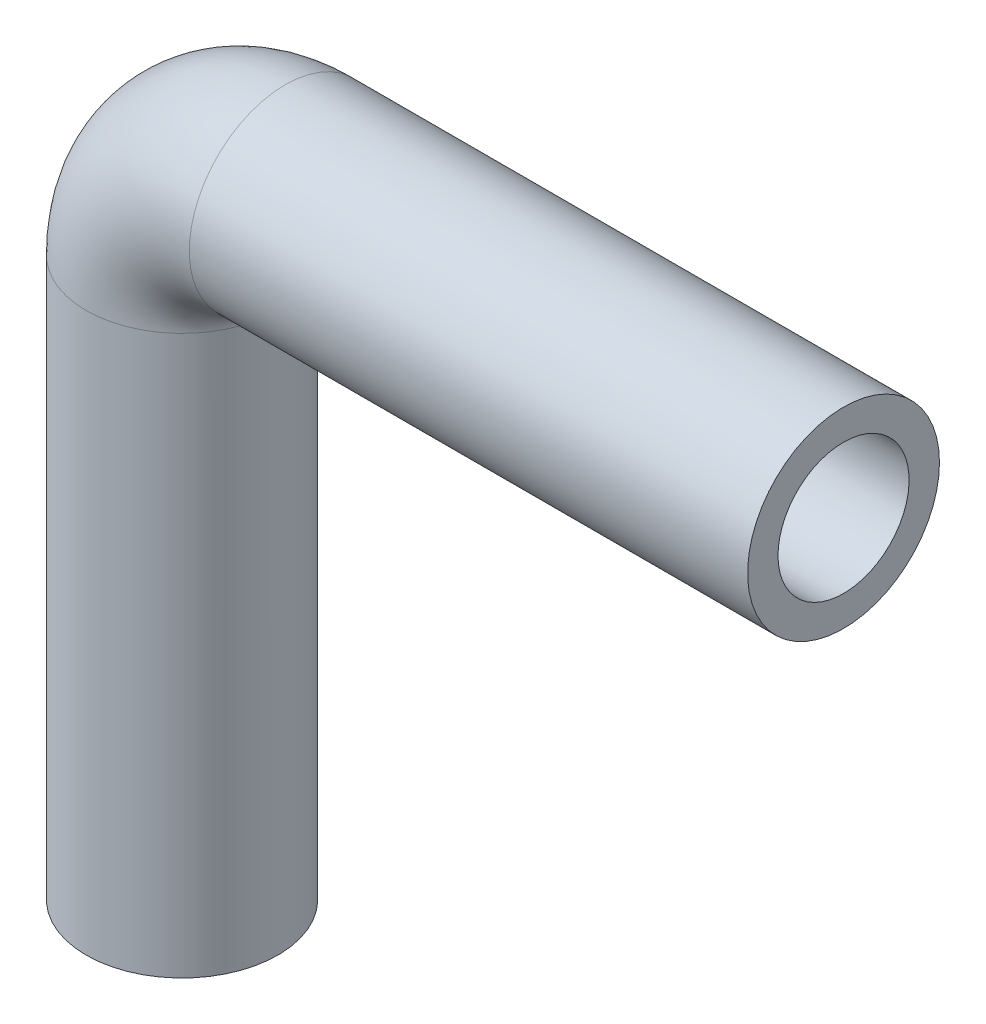
ISO-10303-21;
HEADER;
FILE_DESCRIPTION(('STEP AP214'),'2;1');
FILE_NAME('part.step','',(''),(''),'','','');
FILE_SCHEMA(('AUTOMOTIVE_DESIGN { 1 0 10303 214 1 1 1 1 }'));
ENDSEC;
DATA;
#1=APPLICATION_CONTEXT('core data for automotive mechanical design processes');
#2=APPLICATION_PROTOCOL_DEFINITION('international standard','automotive_design',2000,#1);
#3=PRODUCT_CONTEXT('',#1,'mechanical');
#4=PRODUCT('Part','Part','',(#3));
#5=PRODUCT_RELATED_PRODUCT_CATEGORY('part','',(#4));
#6=PRODUCT_DEFINITION_FORMATION('','',#4);
#7=PRODUCT_DEFINITION_CONTEXT('part definition',#1,'design');
#8=PRODUCT_DEFINITION('design','',#6,#7);
#9=PRODUCT_DEFINITION_SHAPE('','',#8);
#10=(LENGTH_UNIT() NAMED_UNIT(*) SI_UNIT(.MILLI.,.METRE.));
#11=(NAMED_UNIT(*) PLANE_ANGLE_UNIT() SI_UNIT($,.RADIAN.));
#12=(NAMED_UNIT(*) SI_UNIT($,.STERADIAN.) SOLID_ANGLE_UNIT());
#13=UNCERTAINTY_MEASURE_WITH_UNIT(LENGTH_MEASURE(1.E-05),#10,'distance_accuracy_value','');
#14=(GEOMETRIC_REPRESENTATION_CONTEXT(3) GLOBAL_UNCERTAINTY_ASSIGNED_CONTEXT((#13)) GLOBAL_UNIT_ASSIGNED_CONTEXT((#10,
#11,#12)) REPRESENTATION_CONTEXT('',''));
#15=CARTESIAN_POINT('',(0.,0.,0.));
#16=DIRECTION('',(0.,0.,1.));
#17=DIRECTION('',(1.,0.,0.));
#18=AXIS2_PLACEMENT_3D('',#15,#16,#17);
#19=CARTESIAN_POINT('',(0.,0.,0.));
#20=DIRECTION('',(0.,1.,0.));
#21=DIRECTION('',(0.,0.,1.));
#22=AXIS2_PLACEMENT_3D('',#19,#20,#21);
#23=PLANE('',#22);
#24=CARTESIAN_POINT('',(0.,0.,0.));
#25=DIRECTION('',(0.,1.,0.));
#26=DIRECTION('',(0.,0.,1.));
#27=AXIS2_PLACEMENT_3D('',#24,#25,#26);
#28=CIRCLE('',#27,6.235);
#29=CARTESIAN_POINT('',(0.,0.,6.235));
#30=VERTEX_POINT('',#29);
#31=EDGE_CURVE('E95',#30,#30,#28,.T.);
#32=ORIENTED_EDGE('',*,*,#31,.T.);
#33=EDGE_LOOP('',(#32));
#34=FACE_BOUND('',#33,.T.);
#35=CARTESIAN_POINT('',(0.,0.,0.));
#36=DIRECTION('',(0.,1.,0.));
#37=DIRECTION('',(0.,0.,1.));
#38=AXIS2_PLACEMENT_3D('',#35,#36,#37);
#39=CIRCLE('',#38,9.125);
#40=CARTESIAN_POINT('',(0.,0.,9.125));
#41=VERTEX_POINT('',#40);
#42=EDGE_CURVE('E74',#41,#41,#39,.T.);
#43=ORIENTED_EDGE('',*,*,#42,.F.);
#44=EDGE_LOOP('',(#43));
#45=FACE_BOUND('',#44,.T.);
#46=ADVANCED_FACE('F55',(#34,#45),#23,.F.);
#47=CARTESIAN_POINT('',(62.92,62.92,0.));
#48=DIRECTION('',(1.,0.,0.));
#49=DIRECTION('',(0.,0.,1.));
#50=AXIS2_PLACEMENT_3D('',#47,#48,#49);
#51=PLANE('',#50);
#52=CARTESIAN_POINT('',(62.92,62.92,0.));
#53=DIRECTION('',(1.,0.,0.));
#54=DIRECTION('',(0.,0.,1.));
#55=AXIS2_PLACEMENT_3D('',#52,#53,#54);
#56=CIRCLE('',#55,6.235);
#57=CARTESIAN_POINT('',(62.92,62.92,6.235));
#58=VERTEX_POINT('',#57);
#59=EDGE_CURVE('E79',#58,#58,#56,.T.);
#60=ORIENTED_EDGE('',*,*,#59,.F.);
#61=EDGE_LOOP('',(#60));
#62=FACE_BOUND('',#61,.T.);
#63=CARTESIAN_POINT('',(62.92,62.92,0.));
#64=DIRECTION('',(1.,0.,0.));
#65=DIRECTION('',(0.,0.,-1.));
#66=AXIS2_PLACEMENT_3D('',#63,#64,#65);
#67=CIRCLE('',#66,9.125);
#68=CARTESIAN_POINT('',(62.92,62.92,-9.125));
#69=VERTEX_POINT('',#68);
#70=EDGE_CURVE('E11',#69,#69,#67,.T.);
#71=ORIENTED_EDGE('',*,*,#70,.T.);
#72=EDGE_LOOP('',(#71));
#73=FACE_BOUND('',#72,.T.);
#74=ADVANCED_FACE('F119',(#62,#73),#51,.T.);
#75=CARTESIAN_POINT('',(0.,0.,0.));
#76=DIRECTION('',(0.,1.,0.));
#77=DIRECTION('',(0.,0.,1.));
#78=AXIS2_PLACEMENT_3D('',#75,#76,#77);
#79=CYLINDRICAL_SURFACE('',#78,9.125);
#80=CARTESIAN_POINT('',(0.,53.1041430858806,0.));
#81=DIRECTION('',(0.,-1.,0.));
#82=DIRECTION('',(1.,0.,0.));
#83=AXIS2_PLACEMENT_3D('',#80,#81,#82);
#84=CIRCLE('',#83,9.125);
#85=CARTESIAN_POINT('',(-9.125,53.1041430858806,0.));
#86=VERTEX_POINT('',#85);
#87=EDGE_CURVE('E68',#86,#86,#84,.F.);
#88=ORIENTED_EDGE('',*,*,#87,.F.);
#89=EDGE_LOOP('',(#88));
#90=FACE_BOUND('',#89,.T.);
#91=ORIENTED_EDGE('',*,*,#42,.T.);
#92=EDGE_LOOP('',(#91));
#93=FACE_BOUND('',#92,.T.);
#94=ADVANCED_FACE('F122',(#90,#93),#79,.T.);
#95=CARTESIAN_POINT('',(9.8158569141193,53.1041430858807,0.));
#96=DIRECTION('',(0.,0.,-1.));
#97=DIRECTION('',(-1.,0.,0.));
#98=AXIS2_PLACEMENT_3D('',#95,#96,#97);
#99=TOROIDAL_SURFACE('',#98,9.8158569141193,9.125);
#100=CARTESIAN_POINT('',(9.81585691411937,62.92,0.));
#101=DIRECTION('',(1.,0.,0.));
#102=DIRECTION('',(0.,0.,-1.));
#103=AXIS2_PLACEMENT_3D('',#100,#101,#102);
#104=CIRCLE('',#103,9.125);
#105=CARTESIAN_POINT('',(9.81585691411943,72.045,0.));
#106=VERTEX_POINT('',#105);
#107=EDGE_CURVE('E63',#106,#106,#104,.T.);
#108=CARTESIAN_POINT('',(9.8158569141193,53.1041430858807,0.));
#109=DIRECTION('',(0.,0.,-1.));
#110=DIRECTION('',(-1.,0.,0.));
#111=AXIS2_PLACEMENT_3D('',#108,#109,#110);
#112=CIRCLE('',#111,18.9408569141193);
#113=EDGE_CURVE('',#86,#106,#112,.T.);
#114=ORIENTED_EDGE('',*,*,#87,.T.);
#115=ORIENTED_EDGE('',*,*,#107,.F.);
#116=ORIENTED_EDGE('',*,*,#113,.T.);
#117=ORIENTED_EDGE('',*,*,#113,.F.);
#118=EDGE_LOOP('',(#114,#116,#115,#117));
#119=FACE_BOUND('',#118,.T.);
#120=ADVANCED_FACE('F114',(#119),#99,.T.);
#121=CARTESIAN_POINT('',(9.81585691411937,62.92,0.));
#122=DIRECTION('',(1.,0.,0.));
#123=DIRECTION('',(0.,0.,-1.));
#124=AXIS2_PLACEMENT_3D('',#121,#122,#123);
#125=CYLINDRICAL_SURFACE('',#124,9.125);
#126=ORIENTED_EDGE('',*,*,#70,.F.);
#127=EDGE_LOOP('',(#126));
#128=FACE_BOUND('',#127,.T.);
#129=ORIENTED_EDGE('',*,*,#107,.T.);
#130=EDGE_LOOP('',(#129));
#131=FACE_BOUND('',#130,.T.);
#132=ADVANCED_FACE('F57',(#128,#131),#125,.T.);
#133=CARTESIAN_POINT('',(0.,0.,0.));
#134=DIRECTION('',(0.,1.,0.));
#135=DIRECTION('',(0.,0.,1.));
#136=AXIS2_PLACEMENT_3D('',#133,#134,#135);
#137=CYLINDRICAL_SURFACE('',#136,6.235);
#138=CARTESIAN_POINT('',(0.,53.1041430858806,0.));
#139=DIRECTION('',(0.,1.,0.));
#140=DIRECTION('',(0.,0.,1.));
#141=AXIS2_PLACEMENT_3D('',#138,#139,#140);
#142=CIRCLE('',#141,6.235);
#143=CARTESIAN_POINT('',(-6.235,53.1041430858806,0.));
#144=VERTEX_POINT('',#143);
#145=EDGE_CURVE('E89',#144,#144,#142,.T.);
#146=ORIENTED_EDGE('',*,*,#145,.T.);
#147=EDGE_LOOP('',(#146));
#148=FACE_BOUND('',#147,.T.);
#149=ORIENTED_EDGE('',*,*,#31,.F.);
#150=EDGE_LOOP('',(#149));
#151=FACE_BOUND('',#150,.T.);
#152=ADVANCED_FACE('F102',(#148,#151),#137,.F.);
#153=CARTESIAN_POINT('',(9.8158569141193,53.1041430858807,0.));
#154=DIRECTION('',(0.,0.,-1.));
#155=DIRECTION('',(-1.,0.,0.));
#156=AXIS2_PLACEMENT_3D('',#153,#154,#155);
#157=TOROIDAL_SURFACE('',#156,9.8158569141193,6.235);
#158=CARTESIAN_POINT('',(9.81585691411937,62.92,0.));
#159=DIRECTION('',(1.,0.,0.));
#160=DIRECTION('',(0.,0.,1.));
#161=AXIS2_PLACEMENT_3D('',#158,#159,#160);
#162=CIRCLE('',#161,6.235);
#163=CARTESIAN_POINT('',(9.81585691411941,69.155,0.));
#164=VERTEX_POINT('',#163);
#165=EDGE_CURVE('E84',#164,#164,#162,.T.);
#166=CARTESIAN_POINT('',(9.8158569141193,53.1041430858807,0.));
#167=DIRECTION('',(0.,0.,-1.));
#168=DIRECTION('',(-1.,0.,0.));
#169=AXIS2_PLACEMENT_3D('',#166,#167,#168);
#170=CIRCLE('',#169,16.0508569141193);
#171=EDGE_CURVE('',#144,#164,#170,.T.);
#172=ORIENTED_EDGE('',*,*,#145,.F.);
#173=ORIENTED_EDGE('',*,*,#165,.T.);
#174=ORIENTED_EDGE('',*,*,#171,.T.);
#175=ORIENTED_EDGE('',*,*,#171,.F.);
#176=EDGE_LOOP('',(#172,#174,#173,#175));
#177=FACE_BOUND('',#176,.T.);
#178=ADVANCED_FACE('F104',(#177),#157,.F.);
#179=CARTESIAN_POINT('',(9.81585691411937,62.92,0.));
#180=DIRECTION('',(1.,0.,0.));
#181=DIRECTION('',(0.,0.,-1.));
#182=AXIS2_PLACEMENT_3D('',#179,#180,#181);
#183=CYLINDRICAL_SURFACE('',#182,6.235);
#184=ORIENTED_EDGE('',*,*,#59,.T.);
#185=EDGE_LOOP('',(#184));
#186=FACE_BOUND('',#185,.T.);
#187=ORIENTED_EDGE('',*,*,#165,.F.);
#188=EDGE_LOOP('',(#187));
#189=FACE_BOUND('',#188,.T.);
#190=ADVANCED_FACE('F111',(#186,#189),#183,.F.);
#191=CLOSED_SHELL('',(#46,#74,#94,#120,#132,#152,#178,#190));
#192=MANIFOLD_SOLID_BREP('B2',#191);
#193=ADVANCED_BREP_SHAPE_REPRESENTATION('',(#18,#192),#14);
#194=SHAPE_DEFINITION_REPRESENTATION(#9,#193);
ENDSEC;
END-ISO-10303-21;
